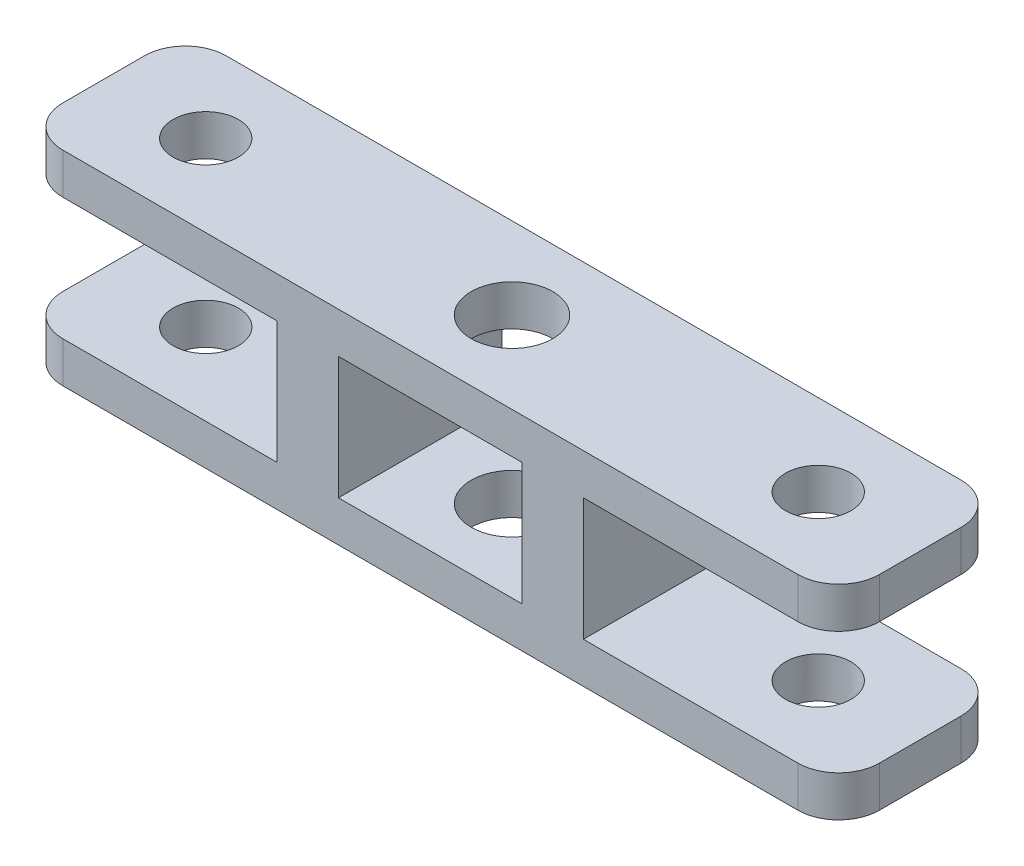
ISO-10303-21;
HEADER;
FILE_DESCRIPTION(('STEP AP214'),'2;1');
FILE_NAME('part.step','',(''),(''),'','','');
FILE_SCHEMA(('AUTOMOTIVE_DESIGN { 1 0 10303 214 1 1 1 1 }'));
ENDSEC;
DATA;
#1=APPLICATION_CONTEXT('core data for automotive mechanical design processes');
#2=APPLICATION_PROTOCOL_DEFINITION('international standard','automotive_design',2000,#1);
#3=PRODUCT_CONTEXT('',#1,'mechanical');
#4=PRODUCT('Part','Part','',(#3));
#5=PRODUCT_RELATED_PRODUCT_CATEGORY('part','',(#4));
#6=PRODUCT_DEFINITION_FORMATION('','',#4);
#7=PRODUCT_DEFINITION_CONTEXT('part definition',#1,'design');
#8=PRODUCT_DEFINITION('design','',#6,#7);
#9=PRODUCT_DEFINITION_SHAPE('','',#8);
#10=(LENGTH_UNIT() NAMED_UNIT(*) SI_UNIT(.MILLI.,.METRE.));
#11=(NAMED_UNIT(*) PLANE_ANGLE_UNIT() SI_UNIT($,.RADIAN.));
#12=(NAMED_UNIT(*) SI_UNIT($,.STERADIAN.) SOLID_ANGLE_UNIT());
#13=UNCERTAINTY_MEASURE_WITH_UNIT(LENGTH_MEASURE(1.E-05),#10,'distance_accuracy_value','');
#14=(GEOMETRIC_REPRESENTATION_CONTEXT(3) GLOBAL_UNCERTAINTY_ASSIGNED_CONTEXT((#13)) GLOBAL_UNIT_ASSIGNED_CONTEXT((#10,
#11,#12)) REPRESENTATION_CONTEXT('',''));
#15=CARTESIAN_POINT('',(0.,0.,0.));
#16=DIRECTION('',(0.,0.,1.));
#17=DIRECTION('',(1.,0.,0.));
#18=AXIS2_PLACEMENT_3D('',#15,#16,#17);
#19=CARTESIAN_POINT('',(0.,2.,0.));
#20=DIRECTION('',(0.,-1.,0.));
#21=DIRECTION('',(0.,0.,-1.));
#22=AXIS2_PLACEMENT_3D('',#19,#20,#21);
#23=PLANE('',#22);
#24=CARTESIAN_POINT('',(15.,2.,0.));
#25=DIRECTION('',(0.,1.,0.));
#26=DIRECTION('',(0.,0.,1.));
#27=AXIS2_PLACEMENT_3D('',#24,#25,#26);
#28=CIRCLE('',#27,1.6);
#29=CARTESIAN_POINT('',(15.,2.,1.6));
#30=VERTEX_POINT('',#29);
#31=EDGE_CURVE('E266',#30,#30,#28,.T.);
#32=ORIENTED_EDGE('',*,*,#31,.F.);
#33=EDGE_LOOP('',(#32));
#34=FACE_BOUND('',#33,.T.);
#35=DIRECTION('',(1.,0.,0.));
#36=VECTOR('',#35,1.);
#37=CARTESIAN_POINT('',(-20.,2.,4.));
#38=LINE('',#37,#36);
#39=CARTESIAN_POINT('',(7.5,2.,4.));
#40=VERTEX_POINT('',#39);
#41=CARTESIAN_POINT('',(18.,2.,4.));
#42=VERTEX_POINT('',#41);
#43=EDGE_CURVE('E295',#40,#42,#38,.T.);
#44=ORIENTED_EDGE('',*,*,#43,.T.);
#45=CARTESIAN_POINT('',(18.,2.,2.));
#46=DIRECTION('',(0.,-1.,0.));
#47=DIRECTION('',(0.,0.,-1.));
#48=AXIS2_PLACEMENT_3D('',#45,#46,#47);
#49=CIRCLE('',#48,2.);
#50=CARTESIAN_POINT('',(20.,2.,2.));
#51=VERTEX_POINT('',#50);
#52=EDGE_CURVE('E333',#42,#51,#49,.F.);
#53=ORIENTED_EDGE('',*,*,#52,.T.);
#54=DIRECTION('',(0.,0.,-1.));
#55=VECTOR('',#54,1.);
#56=CARTESIAN_POINT('',(20.,2.,4.));
#57=LINE('',#56,#55);
#58=CARTESIAN_POINT('',(20.,2.,-2.));
#59=VERTEX_POINT('',#58);
#60=EDGE_CURVE('E284',#51,#59,#57,.T.);
#61=ORIENTED_EDGE('',*,*,#60,.T.);
#62=CARTESIAN_POINT('',(18.,2.,-2.));
#63=DIRECTION('',(0.,-1.,0.));
#64=DIRECTION('',(0.,0.,-1.));
#65=AXIS2_PLACEMENT_3D('',#62,#63,#64);
#66=CIRCLE('',#65,2.);
#67=CARTESIAN_POINT('',(18.,2.,-4.));
#68=VERTEX_POINT('',#67);
#69=EDGE_CURVE('E331',#59,#68,#66,.F.);
#70=ORIENTED_EDGE('',*,*,#69,.T.);
#71=DIRECTION('',(-1.,0.,0.));
#72=VECTOR('',#71,1.);
#73=CARTESIAN_POINT('',(-20.,2.,-4.));
#74=LINE('',#73,#72);
#75=CARTESIAN_POINT('',(7.5,2.,-4.));
#76=VERTEX_POINT('',#75);
#77=EDGE_CURVE('E289',#68,#76,#74,.T.);
#78=ORIENTED_EDGE('',*,*,#77,.T.);
#79=DIRECTION('',(0.,0.,-1.));
#80=VECTOR('',#79,1.);
#81=CARTESIAN_POINT('',(7.5,2.,4.));
#82=LINE('',#81,#80);
#83=EDGE_CURVE('E237',#40,#76,#82,.T.);
#84=ORIENTED_EDGE('',*,*,#83,.F.);
#85=EDGE_LOOP('',(#44,#53,#61,#70,#78,#84));
#86=FACE_BOUND('',#85,.T.);
#87=ADVANCED_FACE('F34',(#34,#86),#23,.F.);
#88=CARTESIAN_POINT('',(0.,2.,0.));
#89=DIRECTION('',(0.,1.,0.));
#90=DIRECTION('',(0.,0.,1.));
#91=AXIS2_PLACEMENT_3D('',#88,#89,#90);
#92=CIRCLE('',#91,2.);
#93=CARTESIAN_POINT('',(0.,2.,2.));
#94=VERTEX_POINT('',#93);
#95=EDGE_CURVE('E278',#94,#94,#92,.T.);
#96=ORIENTED_EDGE('',*,*,#95,.F.);
#97=EDGE_LOOP('',(#96));
#98=FACE_BOUND('',#97,.T.);
#99=DIRECTION('',(0.,0.,1.));
#100=VECTOR('',#99,1.);
#101=CARTESIAN_POINT('',(4.5,2.,4.));
#102=LINE('',#101,#100);
#103=CARTESIAN_POINT('',(4.5,2.,-4.));
#104=VERTEX_POINT('',#103);
#105=CARTESIAN_POINT('',(4.5,2.,4.));
#106=VERTEX_POINT('',#105);
#107=EDGE_CURVE('E234',#104,#106,#102,.T.);
#108=ORIENTED_EDGE('',*,*,#107,.F.);
#109=CARTESIAN_POINT('',(-4.5,2.,-4.));
#110=VERTEX_POINT('',#109);
#111=EDGE_CURVE('E292',#104,#110,#74,.T.);
#112=ORIENTED_EDGE('',*,*,#111,.T.);
#113=DIRECTION('',(0.,0.,-1.));
#114=VECTOR('',#113,1.);
#115=CARTESIAN_POINT('',(-4.5,2.,4.));
#116=LINE('',#115,#114);
#117=CARTESIAN_POINT('',(-4.5,2.,4.));
#118=VERTEX_POINT('',#117);
#119=EDGE_CURVE('E252',#118,#110,#116,.T.);
#120=ORIENTED_EDGE('',*,*,#119,.F.);
#121=EDGE_CURVE('E215',#118,#106,#38,.T.);
#122=ORIENTED_EDGE('',*,*,#121,.T.);
#123=EDGE_LOOP('',(#108,#112,#120,#122));
#124=FACE_BOUND('',#123,.T.);
#125=ADVANCED_FACE('F443',(#98,#124),#23,.F.);
#126=CARTESIAN_POINT('',(-15.,2.,0.));
#127=DIRECTION('',(0.,1.,0.));
#128=DIRECTION('',(0.,0.,-1.));
#129=AXIS2_PLACEMENT_3D('',#126,#127,#128);
#130=CIRCLE('',#129,1.6);
#131=CARTESIAN_POINT('',(-15.,2.,-1.6));
#132=VERTEX_POINT('',#131);
#133=EDGE_CURVE('E273',#132,#132,#130,.T.);
#134=ORIENTED_EDGE('',*,*,#133,.F.);
#135=EDGE_LOOP('',(#134));
#136=FACE_BOUND('',#135,.T.);
#137=CARTESIAN_POINT('',(-7.5,2.,-4.));
#138=VERTEX_POINT('',#137);
#139=CARTESIAN_POINT('',(-18.,2.,-4.));
#140=VERTEX_POINT('',#139);
#141=EDGE_CURVE('E287',#138,#140,#74,.T.);
#142=ORIENTED_EDGE('',*,*,#141,.T.);
#143=CARTESIAN_POINT('',(-18.,2.,-2.));
#144=DIRECTION('',(0.,-1.,0.));
#145=DIRECTION('',(0.,0.,-1.));
#146=AXIS2_PLACEMENT_3D('',#143,#144,#145);
#147=CIRCLE('',#146,2.);
#148=CARTESIAN_POINT('',(-20.,2.,-2.));
#149=VERTEX_POINT('',#148);
#150=EDGE_CURVE('E369',#140,#149,#147,.F.);
#151=ORIENTED_EDGE('',*,*,#150,.T.);
#152=DIRECTION('',(0.,0.,1.));
#153=VECTOR('',#152,1.);
#154=CARTESIAN_POINT('',(-20.,2.,4.));
#155=LINE('',#154,#153);
#156=CARTESIAN_POINT('',(-20.,2.,2.));
#157=VERTEX_POINT('',#156);
#158=EDGE_CURVE('E291',#149,#157,#155,.T.);
#159=ORIENTED_EDGE('',*,*,#158,.T.);
#160=CARTESIAN_POINT('',(-18.,2.,2.));
#161=DIRECTION('',(0.,-1.,0.));
#162=DIRECTION('',(0.,0.,-1.));
#163=AXIS2_PLACEMENT_3D('',#160,#161,#162);
#164=CIRCLE('',#163,2.);
#165=CARTESIAN_POINT('',(-18.,2.,4.));
#166=VERTEX_POINT('',#165);
#167=EDGE_CURVE('E367',#157,#166,#164,.F.);
#168=ORIENTED_EDGE('',*,*,#167,.T.);
#169=CARTESIAN_POINT('',(-7.5,2.,4.));
#170=VERTEX_POINT('',#169);
#171=EDGE_CURVE('E296',#166,#170,#38,.T.);
#172=ORIENTED_EDGE('',*,*,#171,.T.);
#173=DIRECTION('',(0.,0.,1.));
#174=VECTOR('',#173,1.);
#175=CARTESIAN_POINT('',(-7.5,2.,4.));
#176=LINE('',#175,#174);
#177=EDGE_CURVE('E206',#138,#170,#176,.T.);
#178=ORIENTED_EDGE('',*,*,#177,.F.);
#179=EDGE_LOOP('',(#142,#151,#159,#168,#172,#178));
#180=FACE_BOUND('',#179,.T.);
#181=ADVANCED_FACE('F446',(#136,#180),#23,.F.);
#182=CARTESIAN_POINT('',(20.,2.,4.));
#183=DIRECTION('',(-1.,0.,0.));
#184=DIRECTION('',(0.,0.,1.));
#185=AXIS2_PLACEMENT_3D('',#182,#183,#184);
#186=PLANE('',#185);
#187=ORIENTED_EDGE('',*,*,#60,.F.);
#188=DIRECTION('',(0.,-1.,0.));
#189=VECTOR('',#188,1.);
#190=CARTESIAN_POINT('',(20.,2.,2.));
#191=LINE('',#190,#189);
#192=CARTESIAN_POINT('',(20.,0.,2.));
#193=VERTEX_POINT('',#192);
#194=EDGE_CURVE('E310',#51,#193,#191,.T.);
#195=ORIENTED_EDGE('',*,*,#194,.T.);
#196=DIRECTION('',(0.,0.,-1.));
#197=VECTOR('',#196,1.);
#198=CARTESIAN_POINT('',(20.,0.,4.));
#199=LINE('',#198,#197);
#200=CARTESIAN_POINT('',(20.,0.,-2.));
#201=VERTEX_POINT('',#200);
#202=EDGE_CURVE('E281',#193,#201,#199,.T.);
#203=ORIENTED_EDGE('',*,*,#202,.T.);
#204=DIRECTION('',(0.,-1.,0.));
#205=VECTOR('',#204,1.);
#206=CARTESIAN_POINT('',(20.,2.,-2.));
#207=LINE('',#206,#205);
#208=EDGE_CURVE('E298',#201,#59,#207,.F.);
#209=ORIENTED_EDGE('',*,*,#208,.T.);
#210=EDGE_LOOP('',(#187,#195,#203,#209));
#211=FACE_BOUND('',#210,.T.);
#212=ADVANCED_FACE('F456',(#211),#186,.F.);
#213=CARTESIAN_POINT('',(-20.,2.,-4.));
#214=DIRECTION('',(0.,0.,1.));
#215=DIRECTION('',(1.,0.,0.));
#216=AXIS2_PLACEMENT_3D('',#213,#214,#215);
#217=PLANE('',#216);
#218=ORIENTED_EDGE('',*,*,#77,.F.);
#219=DIRECTION('',(0.,-1.,0.));
#220=VECTOR('',#219,1.);
#221=CARTESIAN_POINT('',(18.,2.,-4.));
#222=LINE('',#221,#220);
#223=CARTESIAN_POINT('',(18.,0.,-4.));
#224=VERTEX_POINT('',#223);
#225=EDGE_CURVE('E359',#68,#224,#222,.T.);
#226=ORIENTED_EDGE('',*,*,#225,.T.);
#227=DIRECTION('',(-1.,0.,0.));
#228=VECTOR('',#227,1.);
#229=CARTESIAN_POINT('',(-20.,0.,-4.));
#230=LINE('',#229,#228);
#231=CARTESIAN_POINT('',(-18.,0.,-4.));
#232=VERTEX_POINT('',#231);
#233=EDGE_CURVE('E301',#224,#232,#230,.T.);
#234=ORIENTED_EDGE('',*,*,#233,.T.);
#235=DIRECTION('',(0.,-1.,0.));
#236=VECTOR('',#235,1.);
#237=CARTESIAN_POINT('',(-18.,2.,-4.));
#238=LINE('',#237,#236);
#239=EDGE_CURVE('E354',#232,#140,#238,.F.);
#240=ORIENTED_EDGE('',*,*,#239,.T.);
#241=ORIENTED_EDGE('',*,*,#141,.F.);
#242=DIRECTION('',(0.,-1.,0.));
#243=VECTOR('',#242,1.);
#244=CARTESIAN_POINT('',(-7.5,8.,-4.));
#245=LINE('',#244,#243);
#246=CARTESIAN_POINT('',(-7.5,8.,-4.));
#247=VERTEX_POINT('',#246);
#248=EDGE_CURVE('E261',#247,#138,#245,.T.);
#249=ORIENTED_EDGE('',*,*,#248,.F.);
#250=DIRECTION('',(-1.,0.,0.));
#251=VECTOR('',#250,1.);
#252=CARTESIAN_POINT('',(-20.,8.,-4.));
#253=LINE('',#252,#251);
#254=CARTESIAN_POINT('',(-18.,8.,-4.));
#255=VERTEX_POINT('',#254);
#256=EDGE_CURVE('E386',#247,#255,#253,.T.);
#257=ORIENTED_EDGE('',*,*,#256,.T.);
#258=DIRECTION('',(0.,-1.,0.));
#259=VECTOR('',#258,1.);
#260=CARTESIAN_POINT('',(-18.,2.,-4.));
#261=LINE('',#260,#259);
#262=CARTESIAN_POINT('',(-18.,10.,-4.));
#263=VERTEX_POINT('',#262);
#264=EDGE_CURVE('E352',#255,#263,#261,.F.);
#265=ORIENTED_EDGE('',*,*,#264,.T.);
#266=DIRECTION('',(-1.,0.,0.));
#267=VECTOR('',#266,1.);
#268=CARTESIAN_POINT('',(-20.,10.,-4.));
#269=LINE('',#268,#267);
#270=CARTESIAN_POINT('',(18.,10.,-4.));
#271=VERTEX_POINT('',#270);
#272=EDGE_CURVE('E404',#271,#263,#269,.T.);
#273=ORIENTED_EDGE('',*,*,#272,.F.);
#274=DIRECTION('',(0.,-1.,0.));
#275=VECTOR('',#274,1.);
#276=CARTESIAN_POINT('',(18.,2.,-4.));
#277=LINE('',#276,#275);
#278=CARTESIAN_POINT('',(18.,8.,-4.));
#279=VERTEX_POINT('',#278);
#280=EDGE_CURVE('E356',#271,#279,#277,.T.);
#281=ORIENTED_EDGE('',*,*,#280,.T.);
#282=CARTESIAN_POINT('',(7.5,8.,-4.));
#283=VERTEX_POINT('',#282);
#284=EDGE_CURVE('E384',#279,#283,#253,.T.);
#285=ORIENTED_EDGE('',*,*,#284,.T.);
#286=DIRECTION('',(0.,-1.,0.));
#287=VECTOR('',#286,1.);
#288=CARTESIAN_POINT('',(7.5,8.,-4.));
#289=LINE('',#288,#287);
#290=EDGE_CURVE('E250',#283,#76,#289,.T.);
#291=ORIENTED_EDGE('',*,*,#290,.T.);
#292=EDGE_LOOP('',(#218,#226,#234,#240,#241,#249,#257,#265,#273,#281,#285,#291));
#293=FACE_BOUND('',#292,.T.);
#294=CARTESIAN_POINT('',(4.5,8.,-4.));
#295=VERTEX_POINT('',#294);
#296=CARTESIAN_POINT('',(-4.5,8.,-4.));
#297=VERTEX_POINT('',#296);
#298=EDGE_CURVE('E385',#295,#297,#253,.T.);
#299=ORIENTED_EDGE('',*,*,#298,.T.);
#300=DIRECTION('',(0.,-1.,0.));
#301=VECTOR('',#300,1.);
#302=CARTESIAN_POINT('',(-4.5,8.,-4.));
#303=LINE('',#302,#301);
#304=EDGE_CURVE('E200',#297,#110,#303,.T.);
#305=ORIENTED_EDGE('',*,*,#304,.T.);
#306=ORIENTED_EDGE('',*,*,#111,.F.);
#307=DIRECTION('',(0.,-1.,0.));
#308=VECTOR('',#307,1.);
#309=CARTESIAN_POINT('',(4.5,8.,-4.));
#310=LINE('',#309,#308);
#311=EDGE_CURVE('E247',#295,#104,#310,.T.);
#312=ORIENTED_EDGE('',*,*,#311,.F.);
#313=EDGE_LOOP('',(#299,#305,#306,#312));
#314=FACE_BOUND('',#313,.T.);
#315=ADVANCED_FACE('F461',(#293,#314),#217,.F.);
#316=CARTESIAN_POINT('',(-20.,2.,4.));
#317=DIRECTION('',(1.,0.,0.));
#318=DIRECTION('',(0.,0.,-1.));
#319=AXIS2_PLACEMENT_3D('',#316,#317,#318);
#320=PLANE('',#319);
#321=ORIENTED_EDGE('',*,*,#158,.F.);
#322=DIRECTION('',(0.,-1.,0.));
#323=VECTOR('',#322,1.);
#324=CARTESIAN_POINT('',(-20.,2.,-2.));
#325=LINE('',#324,#323);
#326=CARTESIAN_POINT('',(-20.,0.,-2.));
#327=VERTEX_POINT('',#326);
#328=EDGE_CURVE('E364',#149,#327,#325,.T.);
#329=ORIENTED_EDGE('',*,*,#328,.T.);
#330=DIRECTION('',(0.,0.,1.));
#331=VECTOR('',#330,1.);
#332=CARTESIAN_POINT('',(-20.,0.,4.));
#333=LINE('',#332,#331);
#334=CARTESIAN_POINT('',(-20.,0.,2.));
#335=VERTEX_POINT('',#334);
#336=EDGE_CURVE('E304',#327,#335,#333,.T.);
#337=ORIENTED_EDGE('',*,*,#336,.T.);
#338=DIRECTION('',(0.,-1.,0.));
#339=VECTOR('',#338,1.);
#340=CARTESIAN_POINT('',(-20.,2.,2.));
#341=LINE('',#340,#339);
#342=EDGE_CURVE('E362',#335,#157,#341,.F.);
#343=ORIENTED_EDGE('',*,*,#342,.T.);
#344=EDGE_LOOP('',(#321,#329,#337,#343));
#345=FACE_BOUND('',#344,.T.);
#346=ADVANCED_FACE('F476',(#345),#320,.F.);
#347=CARTESIAN_POINT('',(-20.,2.,4.));
#348=DIRECTION('',(0.,0.,-1.));
#349=DIRECTION('',(-1.,0.,0.));
#350=AXIS2_PLACEMENT_3D('',#347,#348,#349);
#351=PLANE('',#350);
#352=DIRECTION('',(0.,-1.,0.));
#353=VECTOR('',#352,1.);
#354=CARTESIAN_POINT('',(-4.5,8.,4.));
#355=LINE('',#354,#353);
#356=CARTESIAN_POINT('',(-4.5,8.,4.));
#357=VERTEX_POINT('',#356);
#358=EDGE_CURVE('E198',#357,#118,#355,.T.);
#359=ORIENTED_EDGE('',*,*,#358,.F.);
#360=DIRECTION('',(1.,0.,0.));
#361=VECTOR('',#360,1.);
#362=CARTESIAN_POINT('',(-20.,8.,4.));
#363=LINE('',#362,#361);
#364=CARTESIAN_POINT('',(4.5,8.,4.));
#365=VERTEX_POINT('',#364);
#366=EDGE_CURVE('E214',#357,#365,#363,.T.);
#367=ORIENTED_EDGE('',*,*,#366,.T.);
#368=DIRECTION('',(0.,-1.,0.));
#369=VECTOR('',#368,1.);
#370=CARTESIAN_POINT('',(4.5,8.,4.));
#371=LINE('',#370,#369);
#372=EDGE_CURVE('E245',#365,#106,#371,.T.);
#373=ORIENTED_EDGE('',*,*,#372,.T.);
#374=ORIENTED_EDGE('',*,*,#121,.F.);
#375=EDGE_LOOP('',(#359,#367,#373,#374));
#376=FACE_BOUND('',#375,.T.);
#377=DIRECTION('',(1.,0.,0.));
#378=VECTOR('',#377,1.);
#379=CARTESIAN_POINT('',(-20.,0.,4.));
#380=LINE('',#379,#378);
#381=CARTESIAN_POINT('',(-18.,0.,4.));
#382=VERTEX_POINT('',#381);
#383=CARTESIAN_POINT('',(18.,0.,4.));
#384=VERTEX_POINT('',#383);
#385=EDGE_CURVE('E288',#382,#384,#380,.T.);
#386=ORIENTED_EDGE('',*,*,#385,.T.);
#387=DIRECTION('',(0.,-1.,0.));
#388=VECTOR('',#387,1.);
#389=CARTESIAN_POINT('',(18.,2.,4.));
#390=LINE('',#389,#388);
#391=EDGE_CURVE('E329',#384,#42,#390,.F.);
#392=ORIENTED_EDGE('',*,*,#391,.T.);
#393=ORIENTED_EDGE('',*,*,#43,.F.);
#394=DIRECTION('',(0.,-1.,0.));
#395=VECTOR('',#394,1.);
#396=CARTESIAN_POINT('',(7.5,8.,4.));
#397=LINE('',#396,#395);
#398=CARTESIAN_POINT('',(7.5,8.,4.));
#399=VERTEX_POINT('',#398);
#400=EDGE_CURVE('E236',#399,#40,#397,.T.);
#401=ORIENTED_EDGE('',*,*,#400,.F.);
#402=CARTESIAN_POINT('',(18.,8.,4.));
#403=VERTEX_POINT('',#402);
#404=EDGE_CURVE('E223',#399,#403,#363,.T.);
#405=ORIENTED_EDGE('',*,*,#404,.T.);
#406=DIRECTION('',(0.,-1.,0.));
#407=VECTOR('',#406,1.);
#408=CARTESIAN_POINT('',(18.,2.,4.));
#409=LINE('',#408,#407);
#410=CARTESIAN_POINT('',(18.,10.,4.));
#411=VERTEX_POINT('',#410);
#412=EDGE_CURVE('E327',#403,#411,#409,.F.);
#413=ORIENTED_EDGE('',*,*,#412,.T.);
#414=DIRECTION('',(1.,0.,0.));
#415=VECTOR('',#414,1.);
#416=CARTESIAN_POINT('',(-20.,10.,4.));
#417=LINE('',#416,#415);
#418=CARTESIAN_POINT('',(-18.,10.,4.));
#419=VERTEX_POINT('',#418);
#420=EDGE_CURVE('E240',#419,#411,#417,.T.);
#421=ORIENTED_EDGE('',*,*,#420,.F.);
#422=DIRECTION('',(0.,-1.,0.));
#423=VECTOR('',#422,1.);
#424=CARTESIAN_POINT('',(-18.,2.,4.));
#425=LINE('',#424,#423);
#426=CARTESIAN_POINT('',(-18.,8.,4.));
#427=VERTEX_POINT('',#426);
#428=EDGE_CURVE('E321',#419,#427,#425,.T.);
#429=ORIENTED_EDGE('',*,*,#428,.T.);
#430=CARTESIAN_POINT('',(-7.5,8.,4.));
#431=VERTEX_POINT('',#430);
#432=EDGE_CURVE('E222',#427,#431,#363,.T.);
#433=ORIENTED_EDGE('',*,*,#432,.T.);
#434=DIRECTION('',(0.,-1.,0.));
#435=VECTOR('',#434,1.);
#436=CARTESIAN_POINT('',(-7.5,8.,4.));
#437=LINE('',#436,#435);
#438=EDGE_CURVE('E216',#431,#170,#437,.T.);
#439=ORIENTED_EDGE('',*,*,#438,.T.);
#440=ORIENTED_EDGE('',*,*,#171,.F.);
#441=DIRECTION('',(0.,-1.,0.));
#442=VECTOR('',#441,1.);
#443=CARTESIAN_POINT('',(-18.,2.,4.));
#444=LINE('',#443,#442);
#445=EDGE_CURVE('E324',#166,#382,#444,.T.);
#446=ORIENTED_EDGE('',*,*,#445,.T.);
#447=EDGE_LOOP('',(#386,#392,#393,#401,#405,#413,#421,#429,#433,#439,#440,#446));
#448=FACE_BOUND('',#447,.T.);
#449=ADVANCED_FACE('F211',(#376,#448),#351,.F.);
#450=CARTESIAN_POINT('',(0.,0.,0.));
#451=DIRECTION('',(0.,-1.,0.));
#452=DIRECTION('',(0.,0.,-1.));
#453=AXIS2_PLACEMENT_3D('',#450,#451,#452);
#454=PLANE('',#453);
#455=CARTESIAN_POINT('',(15.,0.,0.));
#456=DIRECTION('',(0.,-1.,0.));
#457=DIRECTION('',(0.,0.,-1.));
#458=AXIS2_PLACEMENT_3D('',#455,#456,#457);
#459=CIRCLE('',#458,1.6);
#460=CARTESIAN_POINT('',(15.,0.,-1.6));
#461=VERTEX_POINT('',#460);
#462=EDGE_CURVE('E270',#461,#461,#459,.F.);
#463=ORIENTED_EDGE('',*,*,#462,.T.);
#464=EDGE_LOOP('',(#463));
#465=FACE_BOUND('',#464,.T.);
#466=CARTESIAN_POINT('',(-15.,0.,0.));
#467=DIRECTION('',(0.,-1.,0.));
#468=DIRECTION('',(0.,0.,-1.));
#469=AXIS2_PLACEMENT_3D('',#466,#467,#468);
#470=CIRCLE('',#469,1.6);
#471=CARTESIAN_POINT('',(-15.,0.,-1.6));
#472=VERTEX_POINT('',#471);
#473=EDGE_CURVE('E265',#472,#472,#470,.F.);
#474=ORIENTED_EDGE('',*,*,#473,.T.);
#475=EDGE_LOOP('',(#474));
#476=FACE_BOUND('',#475,.T.);
#477=CARTESIAN_POINT('',(0.,0.,0.));
#478=DIRECTION('',(0.,-1.,0.));
#479=DIRECTION('',(0.,0.,-1.));
#480=AXIS2_PLACEMENT_3D('',#477,#478,#479);
#481=CIRCLE('',#480,2.);
#482=CARTESIAN_POINT('',(0.,0.,-2.));
#483=VERTEX_POINT('',#482);
#484=EDGE_CURVE('E269',#483,#483,#481,.F.);
#485=ORIENTED_EDGE('',*,*,#484,.T.);
#486=EDGE_LOOP('',(#485));
#487=FACE_BOUND('',#486,.T.);
#488=ORIENTED_EDGE('',*,*,#202,.F.);
#489=CARTESIAN_POINT('',(18.,0.,2.));
#490=DIRECTION('',(0.,-1.,0.));
#491=DIRECTION('',(0.,0.,-1.));
#492=AXIS2_PLACEMENT_3D('',#489,#490,#491);
#493=CIRCLE('',#492,2.);
#494=EDGE_CURVE('E319',#193,#384,#493,.T.);
#495=ORIENTED_EDGE('',*,*,#494,.T.);
#496=ORIENTED_EDGE('',*,*,#385,.F.);
#497=CARTESIAN_POINT('',(-18.,0.,2.));
#498=DIRECTION('',(0.,-1.,0.));
#499=DIRECTION('',(0.,0.,-1.));
#500=AXIS2_PLACEMENT_3D('',#497,#498,#499);
#501=CIRCLE('',#500,2.);
#502=EDGE_CURVE('E313',#382,#335,#501,.T.);
#503=ORIENTED_EDGE('',*,*,#502,.T.);
#504=ORIENTED_EDGE('',*,*,#336,.F.);
#505=CARTESIAN_POINT('',(-18.,0.,-2.));
#506=DIRECTION('',(0.,-1.,0.));
#507=DIRECTION('',(0.,0.,-1.));
#508=AXIS2_PLACEMENT_3D('',#505,#506,#507);
#509=CIRCLE('',#508,2.);
#510=EDGE_CURVE('E315',#327,#232,#509,.T.);
#511=ORIENTED_EDGE('',*,*,#510,.T.);
#512=ORIENTED_EDGE('',*,*,#233,.F.);
#513=CARTESIAN_POINT('',(18.,0.,-2.));
#514=DIRECTION('',(0.,-1.,0.));
#515=DIRECTION('',(0.,0.,-1.));
#516=AXIS2_PLACEMENT_3D('',#513,#514,#515);
#517=CIRCLE('',#516,2.);
#518=EDGE_CURVE('E317',#224,#201,#517,.T.);
#519=ORIENTED_EDGE('',*,*,#518,.T.);
#520=EDGE_LOOP('',(#488,#495,#496,#503,#504,#511,#512,#519));
#521=FACE_BOUND('',#520,.T.);
#522=ADVANCED_FACE('F480',(#465,#476,#487,#521),#454,.T.);
#523=CARTESIAN_POINT('',(0.,-0.00100000000000013,0.));
#524=DIRECTION('',(0.,1.,0.));
#525=DIRECTION('',(0.,0.,1.));
#526=AXIS2_PLACEMENT_3D('',#523,#524,#525);
#527=CYLINDRICAL_SURFACE('',#526,2.);
#528=ORIENTED_EDGE('',*,*,#484,.F.);
#529=EDGE_LOOP('',(#528));
#530=FACE_BOUND('',#529,.T.);
#531=ORIENTED_EDGE('',*,*,#95,.T.);
#532=EDGE_LOOP('',(#531));
#533=FACE_BOUND('',#532,.T.);
#534=ADVANCED_FACE('F550',(#530,#533),#527,.F.);
#535=CARTESIAN_POINT('',(-15.,-0.00100000000000013,0.));
#536=DIRECTION('',(0.,1.,0.));
#537=DIRECTION('',(0.,0.,1.));
#538=AXIS2_PLACEMENT_3D('',#535,#536,#537);
#539=CYLINDRICAL_SURFACE('',#538,1.6);
#540=ORIENTED_EDGE('',*,*,#473,.F.);
#541=EDGE_LOOP('',(#540));
#542=FACE_BOUND('',#541,.T.);
#543=ORIENTED_EDGE('',*,*,#133,.T.);
#544=EDGE_LOOP('',(#543));
#545=FACE_BOUND('',#544,.T.);
#546=ADVANCED_FACE('F555',(#542,#545),#539,.F.);
#547=CARTESIAN_POINT('',(15.,-0.00100000000000013,0.));
#548=DIRECTION('',(0.,1.,0.));
#549=DIRECTION('',(0.,0.,1.));
#550=AXIS2_PLACEMENT_3D('',#547,#548,#549);
#551=CYLINDRICAL_SURFACE('',#550,1.6);
#552=ORIENTED_EDGE('',*,*,#462,.F.);
#553=EDGE_LOOP('',(#552));
#554=FACE_BOUND('',#553,.T.);
#555=ORIENTED_EDGE('',*,*,#31,.T.);
#556=EDGE_LOOP('',(#555));
#557=FACE_BOUND('',#556,.T.);
#558=ADVANCED_FACE('F567',(#554,#557),#551,.F.);
#559=CARTESIAN_POINT('',(-4.5,8.,4.));
#560=DIRECTION('',(-1.,0.,0.));
#561=DIRECTION('',(0.,0.,1.));
#562=AXIS2_PLACEMENT_3D('',#559,#560,#561);
#563=PLANE('',#562);
#564=ORIENTED_EDGE('',*,*,#119,.T.);
#565=ORIENTED_EDGE('',*,*,#304,.F.);
#566=DIRECTION('',(0.,0.,-1.));
#567=VECTOR('',#566,1.);
#568=CARTESIAN_POINT('',(-4.5,8.,4.));
#569=LINE('',#568,#567);
#570=EDGE_CURVE('E194',#357,#297,#569,.T.);
#571=ORIENTED_EDGE('',*,*,#570,.F.);
#572=ORIENTED_EDGE('',*,*,#358,.T.);
#573=EDGE_LOOP('',(#564,#565,#571,#572));
#574=FACE_BOUND('',#573,.T.);
#575=ADVANCED_FACE('F197',(#574),#563,.F.);
#576=CARTESIAN_POINT('',(-7.5,8.,4.));
#577=DIRECTION('',(1.,0.,0.));
#578=DIRECTION('',(0.,0.,-1.));
#579=AXIS2_PLACEMENT_3D('',#576,#577,#578);
#580=PLANE('',#579);
#581=ORIENTED_EDGE('',*,*,#177,.T.);
#582=ORIENTED_EDGE('',*,*,#438,.F.);
#583=DIRECTION('',(0.,0.,1.));
#584=VECTOR('',#583,1.);
#585=CARTESIAN_POINT('',(-7.5,8.,4.));
#586=LINE('',#585,#584);
#587=EDGE_CURVE('E205',#247,#431,#586,.T.);
#588=ORIENTED_EDGE('',*,*,#587,.F.);
#589=ORIENTED_EDGE('',*,*,#248,.T.);
#590=EDGE_LOOP('',(#581,#582,#588,#589));
#591=FACE_BOUND('',#590,.T.);
#592=ADVANCED_FACE('F491',(#591),#580,.F.);
#593=CARTESIAN_POINT('',(7.5,8.,4.));
#594=DIRECTION('',(-1.,0.,0.));
#595=DIRECTION('',(0.,0.,1.));
#596=AXIS2_PLACEMENT_3D('',#593,#594,#595);
#597=PLANE('',#596);
#598=ORIENTED_EDGE('',*,*,#83,.T.);
#599=ORIENTED_EDGE('',*,*,#290,.F.);
#600=DIRECTION('',(0.,0.,-1.));
#601=VECTOR('',#600,1.);
#602=CARTESIAN_POINT('',(7.5,8.,4.));
#603=LINE('',#602,#601);
#604=EDGE_CURVE('E231',#399,#283,#603,.T.);
#605=ORIENTED_EDGE('',*,*,#604,.F.);
#606=ORIENTED_EDGE('',*,*,#400,.T.);
#607=EDGE_LOOP('',(#598,#599,#605,#606));
#608=FACE_BOUND('',#607,.T.);
#609=ADVANCED_FACE('F515',(#608),#597,.F.);
#610=CARTESIAN_POINT('',(4.5,8.,4.));
#611=DIRECTION('',(1.,0.,0.));
#612=DIRECTION('',(0.,0.,-1.));
#613=AXIS2_PLACEMENT_3D('',#610,#611,#612);
#614=PLANE('',#613);
#615=ORIENTED_EDGE('',*,*,#107,.T.);
#616=ORIENTED_EDGE('',*,*,#372,.F.);
#617=DIRECTION('',(0.,0.,1.));
#618=VECTOR('',#617,1.);
#619=CARTESIAN_POINT('',(4.5,8.,4.));
#620=LINE('',#619,#618);
#621=EDGE_CURVE('E221',#295,#365,#620,.T.);
#622=ORIENTED_EDGE('',*,*,#621,.F.);
#623=ORIENTED_EDGE('',*,*,#311,.T.);
#624=EDGE_LOOP('',(#615,#616,#622,#623));
#625=FACE_BOUND('',#624,.T.);
#626=ADVANCED_FACE('F500',(#625),#614,.F.);
#627=CARTESIAN_POINT('',(0.,8.,0.));
#628=DIRECTION('',(0.,-1.,0.));
#629=DIRECTION('',(0.,0.,-1.));
#630=AXIS2_PLACEMENT_3D('',#627,#628,#629);
#631=PLANE('',#630);
#632=CARTESIAN_POINT('',(0.,8.,0.));
#633=DIRECTION('',(0.,1.,0.));
#634=DIRECTION('',(0.,0.,1.));
#635=AXIS2_PLACEMENT_3D('',#632,#633,#634);
#636=CIRCLE('',#635,2.);
#637=CARTESIAN_POINT('',(0.,8.,2.));
#638=VERTEX_POINT('',#637);
#639=EDGE_CURVE('E412',#638,#638,#636,.T.);
#640=ORIENTED_EDGE('',*,*,#639,.T.);
#641=EDGE_LOOP('',(#640));
#642=FACE_BOUND('',#641,.T.);
#643=ORIENTED_EDGE('',*,*,#570,.T.);
#644=ORIENTED_EDGE('',*,*,#298,.F.);
#645=ORIENTED_EDGE('',*,*,#621,.T.);
#646=ORIENTED_EDGE('',*,*,#366,.F.);
#647=EDGE_LOOP('',(#643,#644,#645,#646));
#648=FACE_BOUND('',#647,.T.);
#649=ADVANCED_FACE('F219',(#642,#648),#631,.T.);
#650=CARTESIAN_POINT('',(-15.,8.,0.));
#651=DIRECTION('',(0.,1.,0.));
#652=DIRECTION('',(0.,0.,1.));
#653=AXIS2_PLACEMENT_3D('',#650,#651,#652);
#654=CIRCLE('',#653,1.6);
#655=CARTESIAN_POINT('',(-15.,8.,1.60000000000001));
#656=VERTEX_POINT('',#655);
#657=EDGE_CURVE('E418',#656,#656,#654,.T.);
#658=ORIENTED_EDGE('',*,*,#657,.T.);
#659=EDGE_LOOP('',(#658));
#660=FACE_BOUND('',#659,.T.);
#661=DIRECTION('',(0.,0.,1.));
#662=VECTOR('',#661,1.);
#663=CARTESIAN_POINT('',(-20.,8.,4.));
#664=LINE('',#663,#662);
#665=CARTESIAN_POINT('',(-20.,8.,-2.));
#666=VERTEX_POINT('',#665);
#667=CARTESIAN_POINT('',(-20.,8.,2.));
#668=VERTEX_POINT('',#667);
#669=EDGE_CURVE('E227',#666,#668,#664,.T.);
#670=ORIENTED_EDGE('',*,*,#669,.F.);
#671=CARTESIAN_POINT('',(-18.,8.,-2.));
#672=DIRECTION('',(0.,-1.,0.));
#673=DIRECTION('',(0.,0.,-1.));
#674=AXIS2_PLACEMENT_3D('',#671,#672,#673);
#675=CIRCLE('',#674,2.);
#676=EDGE_CURVE('E11',#666,#255,#675,.T.);
#677=ORIENTED_EDGE('',*,*,#676,.T.);
#678=ORIENTED_EDGE('',*,*,#256,.F.);
#679=ORIENTED_EDGE('',*,*,#587,.T.);
#680=ORIENTED_EDGE('',*,*,#432,.F.);
#681=CARTESIAN_POINT('',(-18.,8.,2.));
#682=DIRECTION('',(0.,-1.,0.));
#683=DIRECTION('',(0.,0.,-1.));
#684=AXIS2_PLACEMENT_3D('',#681,#682,#683);
#685=CIRCLE('',#684,2.);
#686=EDGE_CURVE('E42',#427,#668,#685,.T.);
#687=ORIENTED_EDGE('',*,*,#686,.T.);
#688=EDGE_LOOP('',(#670,#677,#678,#679,#680,#687));
#689=FACE_BOUND('',#688,.T.);
#690=ADVANCED_FACE('F381',(#660,#689),#631,.T.);
#691=CARTESIAN_POINT('',(15.,8.,0.));
#692=DIRECTION('',(0.,1.,0.));
#693=DIRECTION('',(0.,0.,1.));
#694=AXIS2_PLACEMENT_3D('',#691,#692,#693);
#695=CIRCLE('',#694,1.6);
#696=CARTESIAN_POINT('',(15.,8.,1.6));
#697=VERTEX_POINT('',#696);
#698=EDGE_CURVE('E398',#697,#697,#695,.T.);
#699=ORIENTED_EDGE('',*,*,#698,.T.);
#700=EDGE_LOOP('',(#699));
#701=FACE_BOUND('',#700,.T.);
#702=DIRECTION('',(0.,0.,-1.));
#703=VECTOR('',#702,1.);
#704=CARTESIAN_POINT('',(20.,8.,4.));
#705=LINE('',#704,#703);
#706=CARTESIAN_POINT('',(20.,8.,2.));
#707=VERTEX_POINT('',#706);
#708=CARTESIAN_POINT('',(20.,8.,-2.));
#709=VERTEX_POINT('',#708);
#710=EDGE_CURVE('E391',#707,#709,#705,.T.);
#711=ORIENTED_EDGE('',*,*,#710,.F.);
#712=CARTESIAN_POINT('',(18.,8.,2.));
#713=DIRECTION('',(0.,-1.,0.));
#714=DIRECTION('',(0.,0.,-1.));
#715=AXIS2_PLACEMENT_3D('',#712,#713,#714);
#716=CIRCLE('',#715,2.);
#717=EDGE_CURVE('E342',#707,#403,#716,.T.);
#718=ORIENTED_EDGE('',*,*,#717,.T.);
#719=ORIENTED_EDGE('',*,*,#404,.F.);
#720=ORIENTED_EDGE('',*,*,#604,.T.);
#721=ORIENTED_EDGE('',*,*,#284,.F.);
#722=CARTESIAN_POINT('',(18.,8.,-2.));
#723=DIRECTION('',(0.,-1.,0.));
#724=DIRECTION('',(0.,0.,-1.));
#725=AXIS2_PLACEMENT_3D('',#722,#723,#724);
#726=CIRCLE('',#725,2.);
#727=EDGE_CURVE('E340',#279,#709,#726,.T.);
#728=ORIENTED_EDGE('',*,*,#727,.T.);
#729=EDGE_LOOP('',(#711,#718,#719,#720,#721,#728));
#730=FACE_BOUND('',#729,.T.);
#731=ADVANCED_FACE('F430',(#701,#730),#631,.T.);
#732=CARTESIAN_POINT('',(0.,10.,0.));
#733=DIRECTION('',(0.,-1.,0.));
#734=DIRECTION('',(0.,0.,-1.));
#735=AXIS2_PLACEMENT_3D('',#732,#733,#734);
#736=PLANE('',#735);
#737=ORIENTED_EDGE('',*,*,#420,.T.);
#738=CARTESIAN_POINT('',(18.,10.,2.));
#739=DIRECTION('',(0.,-1.,0.));
#740=DIRECTION('',(0.,0.,-1.));
#741=AXIS2_PLACEMENT_3D('',#738,#739,#740);
#742=CIRCLE('',#741,2.);
#743=CARTESIAN_POINT('',(20.,10.,2.));
#744=VERTEX_POINT('',#743);
#745=EDGE_CURVE('E350',#411,#744,#742,.F.);
#746=ORIENTED_EDGE('',*,*,#745,.T.);
#747=DIRECTION('',(0.,0.,-1.));
#748=VECTOR('',#747,1.);
#749=CARTESIAN_POINT('',(20.,10.,4.));
#750=LINE('',#749,#748);
#751=CARTESIAN_POINT('',(20.,10.,-2.));
#752=VERTEX_POINT('',#751);
#753=EDGE_CURVE('E225',#744,#752,#750,.T.);
#754=ORIENTED_EDGE('',*,*,#753,.T.);
#755=CARTESIAN_POINT('',(18.,10.,-2.));
#756=DIRECTION('',(0.,-1.,0.));
#757=DIRECTION('',(0.,0.,-1.));
#758=AXIS2_PLACEMENT_3D('',#755,#756,#757);
#759=CIRCLE('',#758,2.);
#760=EDGE_CURVE('E348',#752,#271,#759,.F.);
#761=ORIENTED_EDGE('',*,*,#760,.T.);
#762=ORIENTED_EDGE('',*,*,#272,.T.);
#763=CARTESIAN_POINT('',(-18.,10.,-2.));
#764=DIRECTION('',(0.,-1.,0.));
#765=DIRECTION('',(0.,0.,-1.));
#766=AXIS2_PLACEMENT_3D('',#763,#764,#765);
#767=CIRCLE('',#766,2.);
#768=CARTESIAN_POINT('',(-20.,10.,-2.));
#769=VERTEX_POINT('',#768);
#770=EDGE_CURVE('E346',#263,#769,#767,.F.);
#771=ORIENTED_EDGE('',*,*,#770,.T.);
#772=DIRECTION('',(0.,0.,1.));
#773=VECTOR('',#772,1.);
#774=CARTESIAN_POINT('',(-20.,10.,4.));
#775=LINE('',#774,#773);
#776=CARTESIAN_POINT('',(-20.,10.,2.));
#777=VERTEX_POINT('',#776);
#778=EDGE_CURVE('E379',#769,#777,#775,.T.);
#779=ORIENTED_EDGE('',*,*,#778,.T.);
#780=CARTESIAN_POINT('',(-18.,10.,2.));
#781=DIRECTION('',(0.,-1.,0.));
#782=DIRECTION('',(0.,0.,-1.));
#783=AXIS2_PLACEMENT_3D('',#780,#781,#782);
#784=CIRCLE('',#783,2.);
#785=EDGE_CURVE('E344',#777,#419,#784,.F.);
#786=ORIENTED_EDGE('',*,*,#785,.T.);
#787=EDGE_LOOP('',(#737,#746,#754,#761,#762,#771,#779,#786));
#788=FACE_BOUND('',#787,.T.);
#789=CARTESIAN_POINT('',(15.,10.,0.));
#790=DIRECTION('',(0.,1.,0.));
#791=DIRECTION('',(0.,0.,1.));
#792=AXIS2_PLACEMENT_3D('',#789,#790,#791);
#793=CIRCLE('',#792,1.6);
#794=CARTESIAN_POINT('',(15.,10.,1.6));
#795=VERTEX_POINT('',#794);
#796=EDGE_CURVE('E393',#795,#795,#793,.T.);
#797=ORIENTED_EDGE('',*,*,#796,.F.);
#798=EDGE_LOOP('',(#797));
#799=FACE_BOUND('',#798,.T.);
#800=CARTESIAN_POINT('',(0.,10.,0.));
#801=DIRECTION('',(0.,1.,0.));
#802=DIRECTION('',(0.,0.,1.));
#803=AXIS2_PLACEMENT_3D('',#800,#801,#802);
#804=CIRCLE('',#803,2.);
#805=CARTESIAN_POINT('',(0.,10.,2.));
#806=VERTEX_POINT('',#805);
#807=EDGE_CURVE('E410',#806,#806,#804,.T.);
#808=ORIENTED_EDGE('',*,*,#807,.F.);
#809=EDGE_LOOP('',(#808));
#810=FACE_BOUND('',#809,.T.);
#811=CARTESIAN_POINT('',(-15.,10.,0.));
#812=DIRECTION('',(0.,1.,0.));
#813=DIRECTION('',(0.,0.,1.));
#814=AXIS2_PLACEMENT_3D('',#811,#812,#813);
#815=CIRCLE('',#814,1.6);
#816=CARTESIAN_POINT('',(-15.,10.,1.60000000000001));
#817=VERTEX_POINT('',#816);
#818=EDGE_CURVE('E415',#817,#817,#815,.T.);
#819=ORIENTED_EDGE('',*,*,#818,.F.);
#820=EDGE_LOOP('',(#819));
#821=FACE_BOUND('',#820,.T.);
#822=ADVANCED_FACE('F427',(#788,#799,#810,#821),#736,.F.);
#823=CARTESIAN_POINT('',(20.,10.,4.));
#824=DIRECTION('',(-1.,0.,0.));
#825=DIRECTION('',(0.,0.,1.));
#826=AXIS2_PLACEMENT_3D('',#823,#824,#825);
#827=PLANE('',#826);
#828=ORIENTED_EDGE('',*,*,#753,.F.);
#829=DIRECTION('',(0.,-1.,0.));
#830=VECTOR('',#829,1.);
#831=CARTESIAN_POINT('',(20.,10.,2.));
#832=LINE('',#831,#830);
#833=EDGE_CURVE('E337',#744,#707,#832,.T.);
#834=ORIENTED_EDGE('',*,*,#833,.T.);
#835=ORIENTED_EDGE('',*,*,#710,.T.);
#836=DIRECTION('',(0.,-1.,0.));
#837=VECTOR('',#836,1.);
#838=CARTESIAN_POINT('',(20.,10.,-2.));
#839=LINE('',#838,#837);
#840=EDGE_CURVE('E335',#709,#752,#839,.F.);
#841=ORIENTED_EDGE('',*,*,#840,.T.);
#842=EDGE_LOOP('',(#828,#834,#835,#841));
#843=FACE_BOUND('',#842,.T.);
#844=ADVANCED_FACE('F429',(#843),#827,.F.);
#845=CARTESIAN_POINT('',(-20.,10.,4.));
#846=DIRECTION('',(1.,0.,0.));
#847=DIRECTION('',(0.,0.,-1.));
#848=AXIS2_PLACEMENT_3D('',#845,#846,#847);
#849=PLANE('',#848);
#850=ORIENTED_EDGE('',*,*,#778,.F.);
#851=DIRECTION('',(0.,-1.,0.));
#852=VECTOR('',#851,1.);
#853=CARTESIAN_POINT('',(-20.,10.,-2.));
#854=LINE('',#853,#852);
#855=EDGE_CURVE('E373',#769,#666,#854,.T.);
#856=ORIENTED_EDGE('',*,*,#855,.T.);
#857=ORIENTED_EDGE('',*,*,#669,.T.);
#858=DIRECTION('',(0.,-1.,0.));
#859=VECTOR('',#858,1.);
#860=CARTESIAN_POINT('',(-20.,10.,2.));
#861=LINE('',#860,#859);
#862=EDGE_CURVE('E371',#668,#777,#861,.F.);
#863=ORIENTED_EDGE('',*,*,#862,.T.);
#864=EDGE_LOOP('',(#850,#856,#857,#863));
#865=FACE_BOUND('',#864,.T.);
#866=ADVANCED_FACE('F376',(#865),#849,.F.);
#867=CARTESIAN_POINT('',(15.,10.,0.));
#868=DIRECTION('',(0.,-1.,0.));
#869=DIRECTION('',(0.,0.,-1.));
#870=AXIS2_PLACEMENT_3D('',#867,#868,#869);
#871=CYLINDRICAL_SURFACE('',#870,1.6);
#872=ORIENTED_EDGE('',*,*,#796,.T.);
#873=EDGE_LOOP('',(#872));
#874=FACE_BOUND('',#873,.T.);
#875=ORIENTED_EDGE('',*,*,#698,.F.);
#876=EDGE_LOOP('',(#875));
#877=FACE_BOUND('',#876,.T.);
#878=ADVANCED_FACE('F584',(#874,#877),#871,.F.);
#879=CARTESIAN_POINT('',(0.,10.,0.));
#880=DIRECTION('',(0.,-1.,0.));
#881=DIRECTION('',(0.,0.,-1.));
#882=AXIS2_PLACEMENT_3D('',#879,#880,#881);
#883=CYLINDRICAL_SURFACE('',#882,2.);
#884=ORIENTED_EDGE('',*,*,#807,.T.);
#885=EDGE_LOOP('',(#884));
#886=FACE_BOUND('',#885,.T.);
#887=ORIENTED_EDGE('',*,*,#639,.F.);
#888=EDGE_LOOP('',(#887));
#889=FACE_BOUND('',#888,.T.);
#890=ADVANCED_FACE('F593',(#886,#889),#883,.F.);
#891=CARTESIAN_POINT('',(-15.,10.,0.));
#892=DIRECTION('',(0.,-1.,0.));
#893=DIRECTION('',(0.,0.,-1.));
#894=AXIS2_PLACEMENT_3D('',#891,#892,#893);
#895=CYLINDRICAL_SURFACE('',#894,1.6);
#896=ORIENTED_EDGE('',*,*,#818,.T.);
#897=EDGE_LOOP('',(#896));
#898=FACE_BOUND('',#897,.T.);
#899=ORIENTED_EDGE('',*,*,#657,.F.);
#900=EDGE_LOOP('',(#899));
#901=FACE_BOUND('',#900,.T.);
#902=ADVANCED_FACE('F424',(#898,#901),#895,.F.);
#903=CARTESIAN_POINT('',(18.,2.,2.));
#904=DIRECTION('',(0.,-1.,0.));
#905=DIRECTION('',(0.,0.,-1.));
#906=AXIS2_PLACEMENT_3D('',#903,#904,#905);
#907=CYLINDRICAL_SURFACE('',#906,2.);
#908=ORIENTED_EDGE('',*,*,#52,.F.);
#909=ORIENTED_EDGE('',*,*,#391,.F.);
#910=ORIENTED_EDGE('',*,*,#494,.F.);
#911=ORIENTED_EDGE('',*,*,#194,.F.);
#912=EDGE_LOOP('',(#908,#909,#910,#911));
#913=FACE_BOUND('',#912,.T.);
#914=ADVANCED_FACE('F509',(#913),#907,.T.);
#915=CARTESIAN_POINT('',(18.,10.,2.));
#916=DIRECTION('',(0.,-1.,0.));
#917=DIRECTION('',(0.,0.,-1.));
#918=AXIS2_PLACEMENT_3D('',#915,#916,#917);
#919=CYLINDRICAL_SURFACE('',#918,2.);
#920=ORIENTED_EDGE('',*,*,#745,.F.);
#921=ORIENTED_EDGE('',*,*,#412,.F.);
#922=ORIENTED_EDGE('',*,*,#717,.F.);
#923=ORIENTED_EDGE('',*,*,#833,.F.);
#924=EDGE_LOOP('',(#920,#921,#922,#923));
#925=FACE_BOUND('',#924,.T.);
#926=ADVANCED_FACE('F522',(#925),#919,.T.);
#927=CARTESIAN_POINT('',(18.,2.,-2.));
#928=DIRECTION('',(0.,-1.,0.));
#929=DIRECTION('',(0.,0.,-1.));
#930=AXIS2_PLACEMENT_3D('',#927,#928,#929);
#931=CYLINDRICAL_SURFACE('',#930,2.);
#932=ORIENTED_EDGE('',*,*,#69,.F.);
#933=ORIENTED_EDGE('',*,*,#208,.F.);
#934=ORIENTED_EDGE('',*,*,#518,.F.);
#935=ORIENTED_EDGE('',*,*,#225,.F.);
#936=EDGE_LOOP('',(#932,#933,#934,#935));
#937=FACE_BOUND('',#936,.T.);
#938=ADVANCED_FACE('F513',(#937),#931,.T.);
#939=CARTESIAN_POINT('',(18.,2.,-2.));
#940=DIRECTION('',(0.,-1.,0.));
#941=DIRECTION('',(0.,0.,-1.));
#942=AXIS2_PLACEMENT_3D('',#939,#940,#941);
#943=CYLINDRICAL_SURFACE('',#942,2.);
#944=ORIENTED_EDGE('',*,*,#760,.F.);
#945=ORIENTED_EDGE('',*,*,#840,.F.);
#946=ORIENTED_EDGE('',*,*,#727,.F.);
#947=ORIENTED_EDGE('',*,*,#280,.F.);
#948=EDGE_LOOP('',(#944,#945,#946,#947));
#949=FACE_BOUND('',#948,.T.);
#950=ADVANCED_FACE('F528',(#949),#943,.T.);
#951=CARTESIAN_POINT('',(-18.,2.,-2.));
#952=DIRECTION('',(0.,-1.,0.));
#953=DIRECTION('',(0.,0.,-1.));
#954=AXIS2_PLACEMENT_3D('',#951,#952,#953);
#955=CYLINDRICAL_SURFACE('',#954,2.);
#956=ORIENTED_EDGE('',*,*,#150,.F.);
#957=ORIENTED_EDGE('',*,*,#239,.F.);
#958=ORIENTED_EDGE('',*,*,#510,.F.);
#959=ORIENTED_EDGE('',*,*,#328,.F.);
#960=EDGE_LOOP('',(#956,#957,#958,#959));
#961=FACE_BOUND('',#960,.T.);
#962=ADVANCED_FACE('F473',(#961),#955,.T.);
#963=CARTESIAN_POINT('',(-18.,10.,-2.));
#964=DIRECTION('',(0.,-1.,0.));
#965=DIRECTION('',(0.,0.,-1.));
#966=AXIS2_PLACEMENT_3D('',#963,#964,#965);
#967=CYLINDRICAL_SURFACE('',#966,2.);
#968=ORIENTED_EDGE('',*,*,#770,.F.);
#969=ORIENTED_EDGE('',*,*,#264,.F.);
#970=ORIENTED_EDGE('',*,*,#676,.F.);
#971=ORIENTED_EDGE('',*,*,#855,.F.);
#972=EDGE_LOOP('',(#968,#969,#970,#971));
#973=FACE_BOUND('',#972,.T.);
#974=ADVANCED_FACE('F529',(#973),#967,.T.);
#975=CARTESIAN_POINT('',(-18.,2.,2.));
#976=DIRECTION('',(0.,-1.,0.));
#977=DIRECTION('',(0.,0.,-1.));
#978=AXIS2_PLACEMENT_3D('',#975,#976,#977);
#979=CYLINDRICAL_SURFACE('',#978,2.);
#980=ORIENTED_EDGE('',*,*,#167,.F.);
#981=ORIENTED_EDGE('',*,*,#342,.F.);
#982=ORIENTED_EDGE('',*,*,#502,.F.);
#983=ORIENTED_EDGE('',*,*,#445,.F.);
#984=EDGE_LOOP('',(#980,#981,#982,#983));
#985=FACE_BOUND('',#984,.T.);
#986=ADVANCED_FACE('F486',(#985),#979,.T.);
#987=CARTESIAN_POINT('',(-18.,2.,2.));
#988=DIRECTION('',(0.,-1.,0.));
#989=DIRECTION('',(0.,0.,-1.));
#990=AXIS2_PLACEMENT_3D('',#987,#988,#989);
#991=CYLINDRICAL_SURFACE('',#990,2.);
#992=ORIENTED_EDGE('',*,*,#785,.F.);
#993=ORIENTED_EDGE('',*,*,#862,.F.);
#994=ORIENTED_EDGE('',*,*,#686,.F.);
#995=ORIENTED_EDGE('',*,*,#428,.F.);
#996=EDGE_LOOP('',(#992,#993,#994,#995));
#997=FACE_BOUND('',#996,.T.);
#998=ADVANCED_FACE('F36',(#997),#991,.T.);
#999=CLOSED_SHELL('',(#87,#125,#181,#212,#315,#346,#449,#522,#534,#546,#558,#575,#592,#609,#626,
#649,#690,#731,#822,#844,#866,#878,#890,#902,#914,#926,#938,#950,#962,#974,#986,#998));
#1000=MANIFOLD_SOLID_BREP('B2',#999);
#1001=ADVANCED_BREP_SHAPE_REPRESENTATION('',(#18,#1000),#14);
#1002=SHAPE_DEFINITION_REPRESENTATION(#9,#1001);
ENDSEC;
END-ISO-10303-21;
